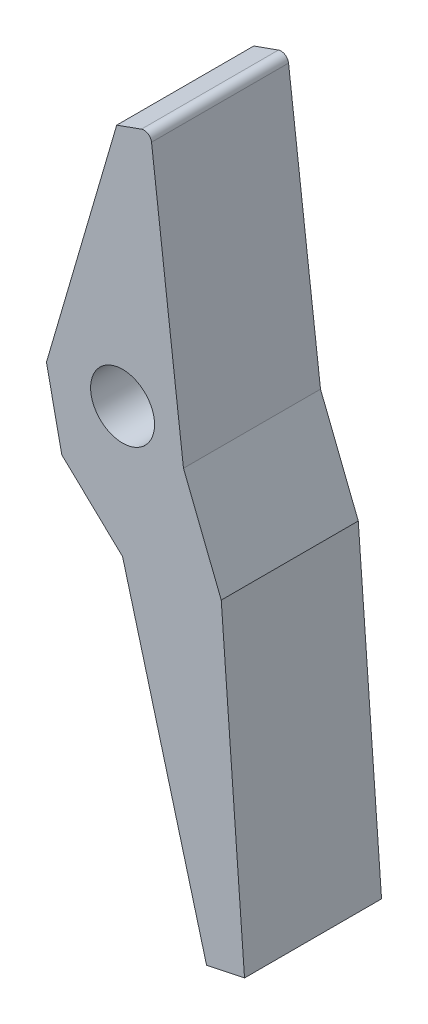
ISO-10303-21;
HEADER;
FILE_DESCRIPTION(('STEP AP214'),'2;1');
FILE_NAME('part.step','',(''),(''),'','','');
FILE_SCHEMA(('AUTOMOTIVE_DESIGN { 1 0 10303 214 1 1 1 1 }'));
ENDSEC;
DATA;
#1=APPLICATION_CONTEXT('core data for automotive mechanical design processes');
#2=APPLICATION_PROTOCOL_DEFINITION('international standard','automotive_design',2000,#1);
#3=PRODUCT_CONTEXT('',#1,'mechanical');
#4=PRODUCT('Part','Part','',(#3));
#5=PRODUCT_RELATED_PRODUCT_CATEGORY('part','',(#4));
#6=PRODUCT_DEFINITION_FORMATION('','',#4);
#7=PRODUCT_DEFINITION_CONTEXT('part definition',#1,'design');
#8=PRODUCT_DEFINITION('design','',#6,#7);
#9=PRODUCT_DEFINITION_SHAPE('','',#8);
#10=(LENGTH_UNIT() NAMED_UNIT(*) SI_UNIT(.MILLI.,.METRE.));
#11=(NAMED_UNIT(*) PLANE_ANGLE_UNIT() SI_UNIT($,.RADIAN.));
#12=(NAMED_UNIT(*) SI_UNIT($,.STERADIAN.) SOLID_ANGLE_UNIT());
#13=UNCERTAINTY_MEASURE_WITH_UNIT(LENGTH_MEASURE(1.E-05),#10,'distance_accuracy_value','');
#14=(GEOMETRIC_REPRESENTATION_CONTEXT(3) GLOBAL_UNCERTAINTY_ASSIGNED_CONTEXT((#13)) GLOBAL_UNIT_ASSIGNED_CONTEXT((#10,
#11,#12)) REPRESENTATION_CONTEXT('',''));
#15=CARTESIAN_POINT('',(0.,0.,0.));
#16=DIRECTION('',(0.,0.,1.));
#17=DIRECTION('',(1.,0.,0.));
#18=AXIS2_PLACEMENT_3D('',#15,#16,#17);
#19=CARTESIAN_POINT('',(0.,0.,4.5));
#20=DIRECTION('',(0.,0.,1.));
#21=DIRECTION('',(1.,0.,0.));
#22=AXIS2_PLACEMENT_3D('',#19,#20,#21);
#23=PLANE('',#22);
#24=DIRECTION('',(-0.119065049974526,0.992886455680892,0.));
#25=VECTOR('',#24,1.);
#26=CARTESIAN_POINT('',(1.82712714630507,16.5877754037634,4.5));
#27=LINE('',#26,#25);
#28=CARTESIAN_POINT('',(4.,-1.53186614354183,4.5));
#29=VERTEX_POINT('',#28);
#30=CARTESIAN_POINT('',(1.90179519306507,15.9651166779995,4.5));
#31=VERTEX_POINT('',#30);
#32=EDGE_CURVE('E207',#29,#31,#27,.T.);
#33=ORIENTED_EDGE('',*,*,#32,.T.);
#34=CARTESIAN_POINT('',(1.40535196522463,15.9055841530122,4.5));
#35=DIRECTION('',(0.,0.,1.));
#36=DIRECTION('',(1.,0.,0.));
#37=AXIS2_PLACEMENT_3D('',#34,#35,#36);
#38=CIRCLE('',#37,0.5);
#39=CARTESIAN_POINT('',(1.23674086467944,16.3762966945627,4.5));
#40=VERTEX_POINT('',#39);
#41=EDGE_CURVE('E11',#31,#40,#38,.T.);
#42=ORIENTED_EDGE('',*,*,#41,.T.);
#43=DIRECTION('',(-0.941425083101018,-0.33722220109038,0.));
#44=VECTOR('',#43,1.);
#45=CARTESIAN_POINT('',(-0.385221798982328,15.795303231201,4.5));
#46=LINE('',#45,#44);
#47=CARTESIAN_POINT('',(-0.385221798982328,15.795303231201,4.5));
#48=VERTEX_POINT('',#47);
#49=EDGE_CURVE('E156',#40,#48,#46,.T.);
#50=ORIENTED_EDGE('',*,*,#49,.T.);
#51=DIRECTION('',(-0.280437637596657,-0.959872247447131,0.));
#52=VECTOR('',#51,1.);
#53=CARTESIAN_POINT('',(-5.,0.,4.5));
#54=LINE('',#53,#52);
#55=CARTESIAN_POINT('',(-5.,0.,4.5));
#56=VERTEX_POINT('',#55);
#57=EDGE_CURVE('E126',#48,#56,#54,.T.);
#58=ORIENTED_EDGE('',*,*,#57,.T.);
#59=DIRECTION('',(0.206896855422974,-0.978362760542369,0.));
#60=VECTOR('',#59,1.);
#61=CARTESIAN_POINT('',(-5.,0.,4.5));
#62=LINE('',#61,#60);
#63=CARTESIAN_POINT('',(-3.99297921638426,-4.76194590665799,4.5));
#64=VERTEX_POINT('',#63);
#65=EDGE_CURVE('E121',#56,#64,#62,.T.);
#66=ORIENTED_EDGE('',*,*,#65,.T.);
#67=DIRECTION('',(0.725054395639814,-0.6886916025068,0.));
#68=VECTOR('',#67,1.);
#69=CARTESIAN_POINT('',(-3.99297921638426,-4.76194590665799,4.5));
#70=LINE('',#69,#68);
#71=CARTESIAN_POINT('',(0.,-8.55466997239016,4.5));
#72=VERTEX_POINT('',#71);
#73=EDGE_CURVE('E110',#64,#72,#70,.T.);
#74=ORIENTED_EDGE('',*,*,#73,.T.);
#75=DIRECTION('',(0.25999285839779,-0.965610539287008,0.));
#76=VECTOR('',#75,1.);
#77=CARTESIAN_POINT('',(0.,-8.55466997239016,4.5));
#78=LINE('',#77,#76);
#79=CARTESIAN_POINT('',(5.5177353626081,-29.0474767824109,4.5));
#80=VERTEX_POINT('',#79);
#81=EDGE_CURVE('E120',#72,#80,#78,.T.);
#82=ORIENTED_EDGE('',*,*,#81,.T.);
#83=DIRECTION('',(0.978362760542369,0.206896855422975,0.));
#84=VECTOR('',#83,1.);
#85=CARTESIAN_POINT('',(5.5177353626081,-29.0474767824109,4.5));
#86=LINE('',#85,#84);
#87=CARTESIAN_POINT('',(8.00960024203871,-28.5205157936185,4.5));
#88=VERTEX_POINT('',#87);
#89=EDGE_CURVE('E189',#80,#88,#86,.T.);
#90=ORIENTED_EDGE('',*,*,#89,.T.);
#91=DIRECTION('',(-0.0735920076556729,0.997288431903834,0.));
#92=VECTOR('',#91,1.);
#93=CARTESIAN_POINT('',(8.00960024203871,-28.5205157936185,4.5));
#94=LINE('',#93,#92);
#95=CARTESIAN_POINT('',(6.47983630473097,-7.7897880037363,4.5));
#96=VERTEX_POINT('',#95);
#97=EDGE_CURVE('E211',#88,#96,#94,.T.);
#98=ORIENTED_EDGE('',*,*,#97,.T.);
#99=DIRECTION('',(-0.368400622927129,0.929667134530905,0.));
#100=VECTOR('',#99,1.);
#101=CARTESIAN_POINT('',(6.47983630473097,-7.7897880037363,4.5));
#102=LINE('',#101,#100);
#103=EDGE_CURVE('E208',#96,#29,#102,.T.);
#104=ORIENTED_EDGE('',*,*,#103,.T.);
#105=EDGE_LOOP('',(#33,#42,#50,#58,#66,#74,#82,#90,#98,#104));
#106=FACE_BOUND('',#105,.T.);
#107=CARTESIAN_POINT('',(0.,0.,4.5));
#108=DIRECTION('',(0.,0.,1.));
#109=DIRECTION('',(1.,0.,0.));
#110=AXIS2_PLACEMENT_3D('',#107,#108,#109);
#111=CIRCLE('',#110,2.1);
#112=CARTESIAN_POINT('',(2.1,0.,4.5));
#113=VERTEX_POINT('',#112);
#114=EDGE_CURVE('E216',#113,#113,#111,.T.);
#115=ORIENTED_EDGE('',*,*,#114,.F.);
#116=EDGE_LOOP('',(#115));
#117=FACE_BOUND('',#116,.T.);
#118=ADVANCED_FACE('F33',(#106,#117),#23,.T.);
#119=CARTESIAN_POINT('',(0.,0.,-4.5));
#120=DIRECTION('',(0.,0.,1.));
#121=DIRECTION('',(1.,0.,0.));
#122=AXIS2_PLACEMENT_3D('',#119,#120,#121);
#123=PLANE('',#122);
#124=DIRECTION('',(-0.941425083101018,-0.33722220109038,0.));
#125=VECTOR('',#124,1.);
#126=CARTESIAN_POINT('',(-0.385221798982328,15.795303231201,-4.5));
#127=LINE('',#126,#125);
#128=CARTESIAN_POINT('',(1.23674086467944,16.3762966945627,-4.5));
#129=VERTEX_POINT('',#128);
#130=CARTESIAN_POINT('',(-0.385221798982328,15.795303231201,-4.5));
#131=VERTEX_POINT('',#130);
#132=EDGE_CURVE('E154',#129,#131,#127,.T.);
#133=ORIENTED_EDGE('',*,*,#132,.F.);
#134=CARTESIAN_POINT('',(1.40535196522463,15.9055841530122,-4.5));
#135=DIRECTION('',(0.,0.,1.));
#136=DIRECTION('',(1.,0.,0.));
#137=AXIS2_PLACEMENT_3D('',#134,#135,#136);
#138=CIRCLE('',#137,0.5);
#139=CARTESIAN_POINT('',(1.90179519306507,15.9651166779995,-4.5));
#140=VERTEX_POINT('',#139);
#141=EDGE_CURVE('E55',#129,#140,#138,.F.);
#142=ORIENTED_EDGE('',*,*,#141,.T.);
#143=DIRECTION('',(-0.119065049974526,0.992886455680892,0.));
#144=VECTOR('',#143,1.);
#145=CARTESIAN_POINT('',(1.82712714630507,16.5877754037634,-4.5));
#146=LINE('',#145,#144);
#147=CARTESIAN_POINT('',(4.,-1.53186614354183,-4.5));
#148=VERTEX_POINT('',#147);
#149=EDGE_CURVE('E162',#148,#140,#146,.T.);
#150=ORIENTED_EDGE('',*,*,#149,.F.);
#151=DIRECTION('',(-0.368400622927129,0.929667134530905,0.));
#152=VECTOR('',#151,1.);
#153=CARTESIAN_POINT('',(6.47983630473097,-7.7897880037363,-4.5));
#154=LINE('',#153,#152);
#155=CARTESIAN_POINT('',(6.47983630473097,-7.7897880037363,-4.5));
#156=VERTEX_POINT('',#155);
#157=EDGE_CURVE('E165',#156,#148,#154,.T.);
#158=ORIENTED_EDGE('',*,*,#157,.F.);
#159=DIRECTION('',(-0.0735920076556729,0.997288431903834,0.));
#160=VECTOR('',#159,1.);
#161=CARTESIAN_POINT('',(8.00960024203871,-28.5205157936185,-4.5));
#162=LINE('',#161,#160);
#163=CARTESIAN_POINT('',(8.00960024203871,-28.5205157936185,-4.5));
#164=VERTEX_POINT('',#163);
#165=EDGE_CURVE('E195',#164,#156,#162,.T.);
#166=ORIENTED_EDGE('',*,*,#165,.F.);
#167=DIRECTION('',(0.978362760542369,0.206896855422975,0.));
#168=VECTOR('',#167,1.);
#169=CARTESIAN_POINT('',(5.5177353626081,-29.0474767824109,-4.5));
#170=LINE('',#169,#168);
#171=CARTESIAN_POINT('',(5.5177353626081,-29.0474767824109,-4.5));
#172=VERTEX_POINT('',#171);
#173=EDGE_CURVE('E188',#172,#164,#170,.T.);
#174=ORIENTED_EDGE('',*,*,#173,.F.);
#175=DIRECTION('',(0.25999285839779,-0.965610539287008,0.));
#176=VECTOR('',#175,1.);
#177=CARTESIAN_POINT('',(0.,-8.55466997239016,-4.5));
#178=LINE('',#177,#176);
#179=CARTESIAN_POINT('',(0.,-8.55466997239016,-4.5));
#180=VERTEX_POINT('',#179);
#181=EDGE_CURVE('E193',#180,#172,#178,.T.);
#182=ORIENTED_EDGE('',*,*,#181,.F.);
#183=DIRECTION('',(0.725054395639814,-0.6886916025068,0.));
#184=VECTOR('',#183,1.);
#185=CARTESIAN_POINT('',(-3.99297921638426,-4.76194590665799,-4.5));
#186=LINE('',#185,#184);
#187=CARTESIAN_POINT('',(-3.99297921638426,-4.76194590665799,-4.5));
#188=VERTEX_POINT('',#187);
#189=EDGE_CURVE('E198',#188,#180,#186,.T.);
#190=ORIENTED_EDGE('',*,*,#189,.F.);
#191=DIRECTION('',(0.206896855422974,-0.978362760542369,0.));
#192=VECTOR('',#191,1.);
#193=CARTESIAN_POINT('',(-5.,0.,-4.5));
#194=LINE('',#193,#192);
#195=CARTESIAN_POINT('',(-5.,0.,-4.5));
#196=VERTEX_POINT('',#195);
#197=EDGE_CURVE('E134',#196,#188,#194,.T.);
#198=ORIENTED_EDGE('',*,*,#197,.F.);
#199=DIRECTION('',(-0.280437637596657,-0.959872247447131,0.));
#200=VECTOR('',#199,1.);
#201=CARTESIAN_POINT('',(-5.,0.,-4.5));
#202=LINE('',#201,#200);
#203=EDGE_CURVE('E130',#131,#196,#202,.T.);
#204=ORIENTED_EDGE('',*,*,#203,.F.);
#205=EDGE_LOOP('',(#133,#142,#150,#158,#166,#174,#182,#190,#198,#204));
#206=FACE_BOUND('',#205,.T.);
#207=CARTESIAN_POINT('',(0.,0.,-4.5));
#208=DIRECTION('',(0.,0.,1.));
#209=DIRECTION('',(1.,0.,0.));
#210=AXIS2_PLACEMENT_3D('',#207,#208,#209);
#211=CIRCLE('',#210,2.1);
#212=CARTESIAN_POINT('',(2.1,0.,-4.5));
#213=VERTEX_POINT('',#212);
#214=EDGE_CURVE('E395',#213,#213,#211,.T.);
#215=ORIENTED_EDGE('',*,*,#214,.T.);
#216=EDGE_LOOP('',(#215));
#217=FACE_BOUND('',#216,.T.);
#218=ADVANCED_FACE('F160',(#206,#217),#123,.F.);
#219=CARTESIAN_POINT('',(-5.,0.,4.5));
#220=DIRECTION('',(0.978362760542369,0.206896855422974,0.));
#221=DIRECTION('',(-0.206896855422974,0.978362760542369,0.));
#222=AXIS2_PLACEMENT_3D('',#219,#220,#221);
#223=PLANE('',#222);
#224=ORIENTED_EDGE('',*,*,#197,.T.);
#225=DIRECTION('',(0.,0.,-1.));
#226=VECTOR('',#225,1.);
#227=CARTESIAN_POINT('',(-3.99297921638426,-4.76194590665799,4.5));
#228=LINE('',#227,#226);
#229=EDGE_CURVE('E114',#64,#188,#228,.T.);
#230=ORIENTED_EDGE('',*,*,#229,.F.);
#231=ORIENTED_EDGE('',*,*,#65,.F.);
#232=DIRECTION('',(0.,0.,-1.));
#233=VECTOR('',#232,1.);
#234=CARTESIAN_POINT('',(-5.,0.,4.5));
#235=LINE('',#234,#233);
#236=EDGE_CURVE('E169',#56,#196,#235,.T.);
#237=ORIENTED_EDGE('',*,*,#236,.T.);
#238=EDGE_LOOP('',(#224,#230,#231,#237));
#239=FACE_BOUND('',#238,.T.);
#240=ADVANCED_FACE('F132',(#239),#223,.F.);
#241=CARTESIAN_POINT('',(-3.99297921638426,-4.76194590665799,4.5));
#242=DIRECTION('',(0.6886916025068,0.725054395639814,0.));
#243=DIRECTION('',(-0.725054395639814,0.6886916025068,0.));
#244=AXIS2_PLACEMENT_3D('',#241,#242,#243);
#245=PLANE('',#244);
#246=ORIENTED_EDGE('',*,*,#189,.T.);
#247=DIRECTION('',(0.,0.,-1.));
#248=VECTOR('',#247,1.);
#249=CARTESIAN_POINT('',(0.,-8.55466997239016,4.5));
#250=LINE('',#249,#248);
#251=EDGE_CURVE('E117',#72,#180,#250,.T.);
#252=ORIENTED_EDGE('',*,*,#251,.F.);
#253=ORIENTED_EDGE('',*,*,#73,.F.);
#254=ORIENTED_EDGE('',*,*,#229,.T.);
#255=EDGE_LOOP('',(#246,#252,#253,#254));
#256=FACE_BOUND('',#255,.T.);
#257=ADVANCED_FACE('F112',(#256),#245,.F.);
#258=CARTESIAN_POINT('',(0.,-8.55466997239016,4.5));
#259=DIRECTION('',(0.965610539287008,0.25999285839779,0.));
#260=DIRECTION('',(-0.25999285839779,0.965610539287008,0.));
#261=AXIS2_PLACEMENT_3D('',#258,#259,#260);
#262=PLANE('',#261);
#263=ORIENTED_EDGE('',*,*,#181,.T.);
#264=DIRECTION('',(0.,0.,-1.));
#265=VECTOR('',#264,1.);
#266=CARTESIAN_POINT('',(5.5177353626081,-29.0474767824109,4.5));
#267=LINE('',#266,#265);
#268=EDGE_CURVE('E140',#80,#172,#267,.T.);
#269=ORIENTED_EDGE('',*,*,#268,.F.);
#270=ORIENTED_EDGE('',*,*,#81,.F.);
#271=ORIENTED_EDGE('',*,*,#251,.T.);
#272=EDGE_LOOP('',(#263,#269,#270,#271));
#273=FACE_BOUND('',#272,.T.);
#274=ADVANCED_FACE('F217',(#273),#262,.F.);
#275=CARTESIAN_POINT('',(5.5177353626081,-29.0474767824109,4.5));
#276=DIRECTION('',(-0.206896855422975,0.978362760542369,0.));
#277=DIRECTION('',(-0.978362760542369,-0.206896855422975,0.));
#278=AXIS2_PLACEMENT_3D('',#275,#276,#277);
#279=PLANE('',#278);
#280=ORIENTED_EDGE('',*,*,#173,.T.);
#281=DIRECTION('',(0.,0.,-1.));
#282=VECTOR('',#281,1.);
#283=CARTESIAN_POINT('',(8.00960024203871,-28.5205157936185,4.5));
#284=LINE('',#283,#282);
#285=EDGE_CURVE('E179',#88,#164,#284,.T.);
#286=ORIENTED_EDGE('',*,*,#285,.F.);
#287=ORIENTED_EDGE('',*,*,#89,.F.);
#288=ORIENTED_EDGE('',*,*,#268,.T.);
#289=EDGE_LOOP('',(#280,#286,#287,#288));
#290=FACE_BOUND('',#289,.T.);
#291=ADVANCED_FACE('F186',(#290),#279,.F.);
#292=CARTESIAN_POINT('',(8.00960024203871,-28.5205157936185,4.5));
#293=DIRECTION('',(-0.997288431903834,-0.0735920076556729,0.));
#294=DIRECTION('',(0.0735920076556729,-0.997288431903834,0.));
#295=AXIS2_PLACEMENT_3D('',#292,#293,#294);
#296=PLANE('',#295);
#297=ORIENTED_EDGE('',*,*,#165,.T.);
#298=DIRECTION('',(0.,0.,-1.));
#299=VECTOR('',#298,1.);
#300=CARTESIAN_POINT('',(6.47983630473097,-7.7897880037363,4.5));
#301=LINE('',#300,#299);
#302=EDGE_CURVE('E176',#96,#156,#301,.T.);
#303=ORIENTED_EDGE('',*,*,#302,.F.);
#304=ORIENTED_EDGE('',*,*,#97,.F.);
#305=ORIENTED_EDGE('',*,*,#285,.T.);
#306=EDGE_LOOP('',(#297,#303,#304,#305));
#307=FACE_BOUND('',#306,.T.);
#308=ADVANCED_FACE('F222',(#307),#296,.F.);
#309=CARTESIAN_POINT('',(6.47983630473097,-7.7897880037363,4.5));
#310=DIRECTION('',(-0.929667134530905,-0.368400622927129,0.));
#311=DIRECTION('',(0.368400622927129,-0.929667134530905,0.));
#312=AXIS2_PLACEMENT_3D('',#309,#310,#311);
#313=PLANE('',#312);
#314=ORIENTED_EDGE('',*,*,#157,.T.);
#315=DIRECTION('',(0.,0.,-1.));
#316=VECTOR('',#315,1.);
#317=CARTESIAN_POINT('',(4.,-1.53186614354183,4.5));
#318=LINE('',#317,#316);
#319=EDGE_CURVE('E173',#29,#148,#318,.T.);
#320=ORIENTED_EDGE('',*,*,#319,.F.);
#321=ORIENTED_EDGE('',*,*,#103,.F.);
#322=ORIENTED_EDGE('',*,*,#302,.T.);
#323=EDGE_LOOP('',(#314,#320,#321,#322));
#324=FACE_BOUND('',#323,.T.);
#325=ADVANCED_FACE('F203',(#324),#313,.F.);
#326=CARTESIAN_POINT('',(1.82712714630507,16.5877754037634,4.5));
#327=DIRECTION('',(-0.992886455680892,-0.119065049974526,0.));
#328=DIRECTION('',(0.119065049974526,-0.992886455680892,0.));
#329=AXIS2_PLACEMENT_3D('',#326,#327,#328);
#330=PLANE('',#329);
#331=ORIENTED_EDGE('',*,*,#149,.T.);
#332=DIRECTION('',(0.,0.,-1.));
#333=VECTOR('',#332,1.);
#334=CARTESIAN_POINT('',(1.90179519306507,15.9651166779995,4.5));
#335=LINE('',#334,#333);
#336=EDGE_CURVE('E41',#140,#31,#335,.F.);
#337=ORIENTED_EDGE('',*,*,#336,.T.);
#338=ORIENTED_EDGE('',*,*,#32,.F.);
#339=ORIENTED_EDGE('',*,*,#319,.T.);
#340=EDGE_LOOP('',(#331,#337,#338,#339));
#341=FACE_BOUND('',#340,.T.);
#342=ADVANCED_FACE('F206',(#341),#330,.F.);
#343=CARTESIAN_POINT('',(-0.385221798982328,15.795303231201,4.5));
#344=DIRECTION('',(0.33722220109038,-0.941425083101018,0.));
#345=DIRECTION('',(0.941425083101018,0.33722220109038,0.));
#346=AXIS2_PLACEMENT_3D('',#343,#344,#345);
#347=PLANE('',#346);
#348=ORIENTED_EDGE('',*,*,#49,.F.);
#349=DIRECTION('',(0.,0.,-1.));
#350=VECTOR('',#349,1.);
#351=CARTESIAN_POINT('',(1.23674086467944,16.3762966945627,4.5));
#352=LINE('',#351,#350);
#353=EDGE_CURVE('E146',#40,#129,#352,.T.);
#354=ORIENTED_EDGE('',*,*,#353,.T.);
#355=ORIENTED_EDGE('',*,*,#132,.T.);
#356=DIRECTION('',(0.,0.,-1.));
#357=VECTOR('',#356,1.);
#358=CARTESIAN_POINT('',(-0.385221798982328,15.795303231201,4.5));
#359=LINE('',#358,#357);
#360=EDGE_CURVE('E171',#48,#131,#359,.T.);
#361=ORIENTED_EDGE('',*,*,#360,.F.);
#362=EDGE_LOOP('',(#348,#354,#355,#361));
#363=FACE_BOUND('',#362,.T.);
#364=ADVANCED_FACE('F152',(#363),#347,.F.);
#365=CARTESIAN_POINT('',(-5.,0.,4.5));
#366=DIRECTION('',(0.959872247447131,-0.280437637596657,0.));
#367=DIRECTION('',(0.280437637596657,0.959872247447131,0.));
#368=AXIS2_PLACEMENT_3D('',#365,#366,#367);
#369=PLANE('',#368);
#370=CARTESIAN_POINT('',(-2.36327255632277,9.02489950692038,0.));
#371=DIRECTION('',(-0.959872247447131,0.280437637596657,0.));
#372=DIRECTION('',(-0.280437637596657,-0.959872247447131,0.));
#373=AXIS2_PLACEMENT_3D('',#370,#371,#372);
#374=CIRCLE('',#373,3.1);
#375=CARTESIAN_POINT('',(-3.23262923287241,6.04929553983428,0.));
#376=VERTEX_POINT('',#375);
#377=EDGE_CURVE('E388',#376,#376,#374,.T.);
#378=ORIENTED_EDGE('',*,*,#377,.F.);
#379=EDGE_LOOP('',(#378));
#380=FACE_BOUND('',#379,.T.);
#381=ORIENTED_EDGE('',*,*,#203,.T.);
#382=ORIENTED_EDGE('',*,*,#236,.F.);
#383=ORIENTED_EDGE('',*,*,#57,.F.);
#384=ORIENTED_EDGE('',*,*,#360,.T.);
#385=EDGE_LOOP('',(#381,#382,#383,#384));
#386=FACE_BOUND('',#385,.T.);
#387=ADVANCED_FACE('F241',(#380,#386),#369,.F.);
#388=CARTESIAN_POINT('',(0.,0.,4.5));
#389=DIRECTION('',(0.,0.,-1.));
#390=DIRECTION('',(-1.,0.,0.));
#391=AXIS2_PLACEMENT_3D('',#388,#389,#390);
#392=CYLINDRICAL_SURFACE('',#391,2.1);
#393=ORIENTED_EDGE('',*,*,#114,.T.);
#394=EDGE_LOOP('',(#393));
#395=FACE_BOUND('',#394,.T.);
#396=ORIENTED_EDGE('',*,*,#214,.F.);
#397=EDGE_LOOP('',(#396));
#398=FACE_BOUND('',#397,.T.);
#399=ADVANCED_FACE('F238',(#395,#398),#392,.F.);
#400=CARTESIAN_POINT('',(-0.443528061428509,8.46402423172707,0.));
#401=DIRECTION('',(-0.959872247447131,0.280437637596657,0.));
#402=DIRECTION('',(-0.280437637596657,-0.959872247447131,0.));
#403=AXIS2_PLACEMENT_3D('',#400,#401,#402);
#404=CYLINDRICAL_SURFACE('',#403,3.1);
#405=CARTESIAN_POINT('',(-0.443528061428509,8.46402423172707,0.));
#406=DIRECTION('',(-0.959872247447131,0.280437637596657,0.));
#407=DIRECTION('',(-0.280437637596657,-0.959872247447131,0.));
#408=AXIS2_PLACEMENT_3D('',#405,#406,#407);
#409=CIRCLE('',#408,3.1);
#410=CARTESIAN_POINT('',(-1.31288473797815,5.48842026464096,0.));
#411=VERTEX_POINT('',#410);
#412=EDGE_CURVE('E391',#411,#411,#409,.T.);
#413=ORIENTED_EDGE('',*,*,#412,.F.);
#414=EDGE_LOOP('',(#413));
#415=FACE_BOUND('',#414,.T.);
#416=ORIENTED_EDGE('',*,*,#377,.T.);
#417=EDGE_LOOP('',(#416));
#418=FACE_BOUND('',#417,.T.);
#419=ADVANCED_FACE('F270',(#415,#418),#404,.F.);
#420=CARTESIAN_POINT('',(-0.443528061428509,8.46402423172707,0.));
#421=DIRECTION('',(-0.959872247447131,0.280437637596657,0.));
#422=DIRECTION('',(-0.280437637596657,-0.959872247447131,0.));
#423=AXIS2_PLACEMENT_3D('',#420,#421,#422);
#424=PLANE('',#423);
#425=CARTESIAN_POINT('',(-0.443528061428509,8.46402423172707,0.));
#426=DIRECTION('',(-0.959872247447131,0.280437637596657,0.));
#427=DIRECTION('',(-0.280437637596657,-0.959872247447131,0.));
#428=AXIS2_PLACEMENT_3D('',#425,#426,#427);
#429=CIRCLE('',#428,2.4);
#430=CARTESIAN_POINT('',(-1.11657839166049,6.16033083785395,0.));
#431=VERTEX_POINT('',#430);
#432=EDGE_CURVE('E387',#431,#431,#429,.T.);
#433=ORIENTED_EDGE('',*,*,#432,.F.);
#434=EDGE_LOOP('',(#433));
#435=FACE_BOUND('',#434,.T.);
#436=ORIENTED_EDGE('',*,*,#412,.T.);
#437=EDGE_LOOP('',(#436));
#438=FACE_BOUND('',#437,.T.);
#439=ADVANCED_FACE('F277',(#435,#438),#424,.T.);
#440=CARTESIAN_POINT('',(-4.28301705121703,9.5857747821137,0.));
#441=DIRECTION('',(-0.959872247447131,0.280437637596657,0.));
#442=DIRECTION('',(-0.280437637596657,-0.959872247447131,0.));
#443=AXIS2_PLACEMENT_3D('',#440,#441,#442);
#444=PLANE('',#443);
#445=CARTESIAN_POINT('',(-4.28301705121703,9.5857747821137,0.));
#446=DIRECTION('',(-0.959872247447131,0.280437637596657,0.));
#447=DIRECTION('',(-0.280437637596657,-0.959872247447131,0.));
#448=AXIS2_PLACEMENT_3D('',#445,#446,#447);
#449=CIRCLE('',#448,0.65);
#450=CARTESIAN_POINT('',(-4.46530151565486,8.96185782127307,0.));
#451=VERTEX_POINT('',#450);
#452=EDGE_CURVE('E135',#451,#451,#449,.T.);
#453=ORIENTED_EDGE('',*,*,#452,.T.);
#454=EDGE_LOOP('',(#453));
#455=FACE_BOUND('',#454,.T.);
#456=ADVANCED_FACE('F285',(#455),#444,.T.);
#457=CARTESIAN_POINT('',(-2.60324061818456,9.09500891631955,0.));
#458=DIRECTION('',(-0.959872247447131,0.280437637596657,0.));
#459=DIRECTION('',(-0.280437637596657,-0.959872247447131,0.));
#460=AXIS2_PLACEMENT_3D('',#457,#458,#459);
#461=DEGENERATE_TOROIDAL_SURFACE('',#460,0.65,1.75,.T.);
#462=CARTESIAN_POINT('',(-2.60324061818456,9.09500891631955,0.));
#463=DIRECTION('',(-0.959872247447131,0.280437637596657,0.));
#464=DIRECTION('',(-0.280437637596657,-0.959872247447131,0.));
#465=AXIS2_PLACEMENT_3D('',#462,#463,#464);
#466=CIRCLE('',#465,2.4);
#467=CARTESIAN_POINT('',(-3.27629094841653,6.79131552244644,0.));
#468=VERTEX_POINT('',#467);
#469=EDGE_CURVE('E138',#468,#468,#466,.F.);
#470=ORIENTED_EDGE('',*,*,#469,.F.);
#471=EDGE_LOOP('',(#470));
#472=FACE_BOUND('',#471,.T.);
#473=ORIENTED_EDGE('',*,*,#452,.F.);
#474=EDGE_LOOP('',(#473));
#475=FACE_BOUND('',#474,.T.);
#476=ADVANCED_FACE('F293',(#472,#475),#461,.T.);
#477=CARTESIAN_POINT('',(-4.28301705121703,9.5857747821137,0.));
#478=DIRECTION('',(0.959872247447131,-0.280437637596657,0.));
#479=DIRECTION('',(0.280437637596657,0.959872247447131,0.));
#480=AXIS2_PLACEMENT_3D('',#477,#478,#479);
#481=CYLINDRICAL_SURFACE('',#480,2.4);
#482=ORIENTED_EDGE('',*,*,#469,.T.);
#483=EDGE_LOOP('',(#482));
#484=FACE_BOUND('',#483,.T.);
#485=ORIENTED_EDGE('',*,*,#432,.T.);
#486=EDGE_LOOP('',(#485));
#487=FACE_BOUND('',#486,.T.);
#488=ADVANCED_FACE('F300',(#484,#487),#481,.T.);
#489=CARTESIAN_POINT('',(1.40535196522463,15.9055841530122,4.5));
#490=DIRECTION('',(0.,0.,-1.));
#491=DIRECTION('',(-1.,0.,0.));
#492=AXIS2_PLACEMENT_3D('',#489,#490,#491);
#493=CYLINDRICAL_SURFACE('',#492,0.5);
#494=ORIENTED_EDGE('',*,*,#41,.F.);
#495=ORIENTED_EDGE('',*,*,#336,.F.);
#496=ORIENTED_EDGE('',*,*,#141,.F.);
#497=ORIENTED_EDGE('',*,*,#353,.F.);
#498=EDGE_LOOP('',(#494,#495,#496,#497));
#499=FACE_BOUND('',#498,.T.);
#500=ADVANCED_FACE('F35',(#499),#493,.T.);
#501=CLOSED_SHELL('',(#118,#218,#240,#257,#274,#291,#308,#325,#342,#364,#387,#399,#419,#439,
#456,#476,#488,#500));
#502=MANIFOLD_SOLID_BREP('B2',#501);
#503=ADVANCED_BREP_SHAPE_REPRESENTATION('',(#18,#502),#14);
#504=SHAPE_DEFINITION_REPRESENTATION(#9,#503);
ENDSEC;
END-ISO-10303-21;
